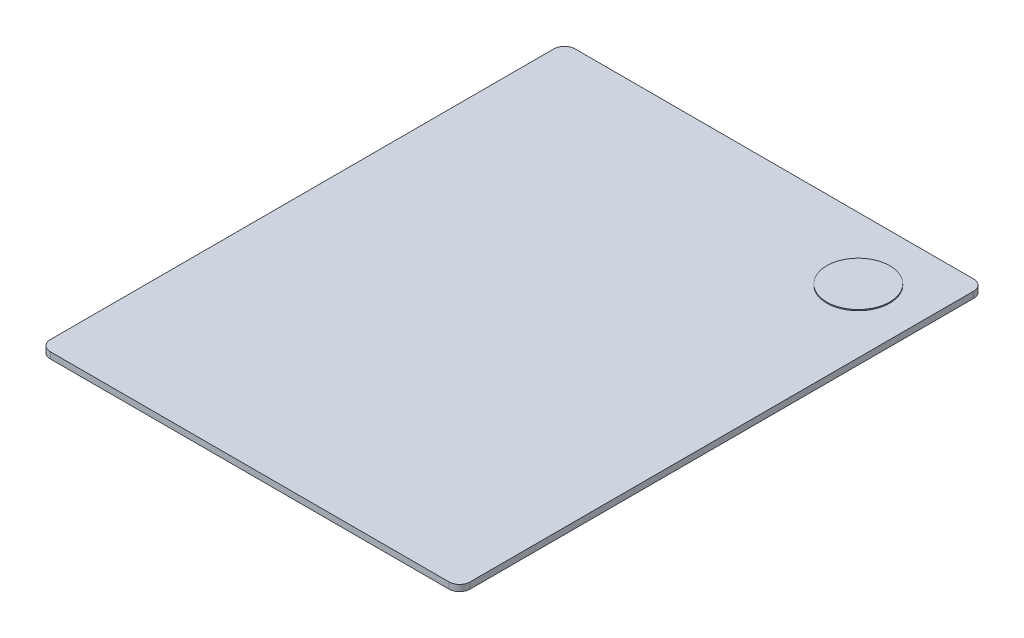
ISO-10303-21;
HEADER;
FILE_DESCRIPTION(('STEP AP214'),'2;1');
FILE_NAME('part.step','',(''),(''),'','','');
FILE_SCHEMA(('AUTOMOTIVE_DESIGN { 1 0 10303 214 1 1 1 1 }'));
ENDSEC;
DATA;
#1=APPLICATION_CONTEXT('core data for automotive mechanical design processes');
#2=APPLICATION_PROTOCOL_DEFINITION('international standard','automotive_design',2000,#1);
#3=PRODUCT_CONTEXT('',#1,'mechanical');
#4=PRODUCT('Part','Part','',(#3));
#5=PRODUCT_RELATED_PRODUCT_CATEGORY('part','',(#4));
#6=PRODUCT_DEFINITION_FORMATION('','',#4);
#7=PRODUCT_DEFINITION_CONTEXT('part definition',#1,'design');
#8=PRODUCT_DEFINITION('design','',#6,#7);
#9=PRODUCT_DEFINITION_SHAPE('','',#8);
#10=(LENGTH_UNIT() NAMED_UNIT(*) SI_UNIT(.MILLI.,.METRE.));
#11=(NAMED_UNIT(*) PLANE_ANGLE_UNIT() SI_UNIT($,.RADIAN.));
#12=(NAMED_UNIT(*) SI_UNIT($,.STERADIAN.) SOLID_ANGLE_UNIT());
#13=UNCERTAINTY_MEASURE_WITH_UNIT(LENGTH_MEASURE(1.E-05),#10,'distance_accuracy_value','');
#14=(GEOMETRIC_REPRESENTATION_CONTEXT(3) GLOBAL_UNCERTAINTY_ASSIGNED_CONTEXT((#13)) GLOBAL_UNIT_ASSIGNED_CONTEXT((#10,
#11,#12)) REPRESENTATION_CONTEXT('',''));
#15=CARTESIAN_POINT('',(0.,0.,0.));
#16=DIRECTION('',(0.,0.,1.));
#17=DIRECTION('',(1.,0.,0.));
#18=AXIS2_PLACEMENT_3D('',#15,#16,#17);
#19=CARTESIAN_POINT('',(70.,3.5,-94.9999999999999));
#20=DIRECTION('',(0.,-1.,0.));
#21=DIRECTION('',(0.,0.,-1.));
#22=AXIS2_PLACEMENT_3D('',#19,#20,#21);
#23=CYLINDRICAL_SURFACE('',#22,15.);
#24=CARTESIAN_POINT('',(70.,3.5,-94.9999999999999));
#25=DIRECTION('',(0.,1.,0.));
#26=DIRECTION('',(0.,0.,1.));
#27=AXIS2_PLACEMENT_3D('',#24,#25,#26);
#28=CIRCLE('',#27,15.);
#29=CARTESIAN_POINT('',(70.,3.5,-79.9999999999999));
#30=VERTEX_POINT('',#29);
#31=EDGE_CURVE('E11',#30,#30,#28,.T.);
#32=ORIENTED_EDGE('',*,*,#31,.F.);
#33=EDGE_LOOP('',(#32));
#34=FACE_BOUND('',#33,.T.);
#35=CARTESIAN_POINT('',(70.,3.,-94.9999999999999));
#36=DIRECTION('',(0.,1.,0.));
#37=DIRECTION('',(0.,0.,1.));
#38=AXIS2_PLACEMENT_3D('',#35,#36,#37);
#39=CIRCLE('',#38,15.);
#40=CARTESIAN_POINT('',(70.,3.,-79.9999999999999));
#41=VERTEX_POINT('',#40);
#42=EDGE_CURVE('E45',#41,#41,#39,.T.);
#43=ORIENTED_EDGE('',*,*,#42,.T.);
#44=EDGE_LOOP('',(#43));
#45=FACE_BOUND('',#44,.T.);
#46=ADVANCED_FACE('F42',(#34,#45),#23,.T.);
#47=CARTESIAN_POINT('',(0.,3.5,0.));
#48=DIRECTION('',(0.,1.,0.));
#49=DIRECTION('',(0.,0.,1.));
#50=AXIS2_PLACEMENT_3D('',#47,#48,#49);
#51=PLANE('',#50);
#52=ORIENTED_EDGE('',*,*,#31,.T.);
#53=EDGE_LOOP('',(#52));
#54=FACE_BOUND('',#53,.T.);
#55=ADVANCED_FACE('F57',(#54),#51,.T.);
#56=CARTESIAN_POINT('',(0.,3.,0.));
#57=DIRECTION('',(0.,1.,0.));
#58=DIRECTION('',(0.,0.,1.));
#59=AXIS2_PLACEMENT_3D('',#56,#57,#58);
#60=PLANE('',#59);
#61=ORIENTED_EDGE('',*,*,#42,.F.);
#62=EDGE_LOOP('',(#61));
#63=FACE_BOUND('',#62,.T.);
#64=ADVANCED_FACE('F55',(#63),#60,.F.);
#65=CLOSED_SHELL('',(#46,#55,#64));
#66=MANIFOLD_SOLID_BREP('B2',#65);
#67=CARTESIAN_POINT('',(-100.,3.,-125.));
#68=DIRECTION('',(1.,0.,0.));
#69=DIRECTION('',(0.,0.,-1.));
#70=AXIS2_PLACEMENT_3D('',#67,#68,#69);
#71=PLANE('',#70);
#72=DIRECTION('',(0.,0.,1.));
#73=VECTOR('',#72,1.);
#74=CARTESIAN_POINT('',(-100.,3.,-125.));
#75=LINE('',#74,#73);
#76=CARTESIAN_POINT('',(-100.,3.,-120.));
#77=VERTEX_POINT('',#76);
#78=CARTESIAN_POINT('',(-100.,3.,120.));
#79=VERTEX_POINT('',#78);
#80=EDGE_CURVE('E167',#77,#79,#75,.T.);
#81=ORIENTED_EDGE('',*,*,#80,.F.);
#82=DIRECTION('',(0.,-1.,0.));
#83=VECTOR('',#82,1.);
#84=CARTESIAN_POINT('',(-100.,3.,-120.));
#85=LINE('',#84,#83);
#86=CARTESIAN_POINT('',(-100.,0.,-120.));
#87=VERTEX_POINT('',#86);
#88=EDGE_CURVE('E152',#77,#87,#85,.T.);
#89=ORIENTED_EDGE('',*,*,#88,.T.);
#90=DIRECTION('',(0.,0.,1.));
#91=VECTOR('',#90,1.);
#92=CARTESIAN_POINT('',(-100.,0.,-125.));
#93=LINE('',#92,#91);
#94=CARTESIAN_POINT('',(-100.,0.,120.));
#95=VERTEX_POINT('',#94);
#96=EDGE_CURVE('E164',#87,#95,#93,.T.);
#97=ORIENTED_EDGE('',*,*,#96,.T.);
#98=DIRECTION('',(0.,-1.,0.));
#99=VECTOR('',#98,1.);
#100=CARTESIAN_POINT('',(-100.,3.,120.));
#101=LINE('',#100,#99);
#102=EDGE_CURVE('E169',#95,#79,#101,.F.);
#103=ORIENTED_EDGE('',*,*,#102,.T.);
#104=EDGE_LOOP('',(#81,#89,#97,#103));
#105=FACE_BOUND('',#104,.T.);
#106=ADVANCED_FACE('F82',(#105),#71,.F.);
#107=CARTESIAN_POINT('',(100.,3.,125.));
#108=DIRECTION('',(0.,0.,-1.));
#109=DIRECTION('',(-1.,0.,0.));
#110=AXIS2_PLACEMENT_3D('',#107,#108,#109);
#111=PLANE('',#110);
#112=DIRECTION('',(1.,0.,0.));
#113=VECTOR('',#112,1.);
#114=CARTESIAN_POINT('',(100.,3.,125.));
#115=LINE('',#114,#113);
#116=CARTESIAN_POINT('',(-95.,3.,125.));
#117=VERTEX_POINT('',#116);
#118=CARTESIAN_POINT('',(95.,3.,125.));
#119=VERTEX_POINT('',#118);
#120=EDGE_CURVE('E209',#117,#119,#115,.T.);
#121=ORIENTED_EDGE('',*,*,#120,.F.);
#122=DIRECTION('',(0.,-1.,0.));
#123=VECTOR('',#122,1.);
#124=CARTESIAN_POINT('',(-95.,3.,125.));
#125=LINE('',#124,#123);
#126=CARTESIAN_POINT('',(-95.,0.,125.));
#127=VERTEX_POINT('',#126);
#128=EDGE_CURVE('E202',#117,#127,#125,.T.);
#129=ORIENTED_EDGE('',*,*,#128,.T.);
#130=DIRECTION('',(1.,0.,0.));
#131=VECTOR('',#130,1.);
#132=CARTESIAN_POINT('',(100.,0.,125.));
#133=LINE('',#132,#131);
#134=CARTESIAN_POINT('',(95.,0.,125.));
#135=VERTEX_POINT('',#134);
#136=EDGE_CURVE('E173',#127,#135,#133,.T.);
#137=ORIENTED_EDGE('',*,*,#136,.T.);
#138=DIRECTION('',(0.,-1.,0.));
#139=VECTOR('',#138,1.);
#140=CARTESIAN_POINT('',(95.,3.,125.));
#141=LINE('',#140,#139);
#142=EDGE_CURVE('E200',#135,#119,#141,.F.);
#143=ORIENTED_EDGE('',*,*,#142,.T.);
#144=EDGE_LOOP('',(#121,#129,#137,#143));
#145=FACE_BOUND('',#144,.T.);
#146=ADVANCED_FACE('F207',(#145),#111,.F.);
#147=CARTESIAN_POINT('',(100.,3.,-125.));
#148=DIRECTION('',(-1.,0.,0.));
#149=DIRECTION('',(0.,0.,1.));
#150=AXIS2_PLACEMENT_3D('',#147,#148,#149);
#151=PLANE('',#150);
#152=DIRECTION('',(0.,0.,-1.));
#153=VECTOR('',#152,1.);
#154=CARTESIAN_POINT('',(100.,3.,-125.));
#155=LINE('',#154,#153);
#156=CARTESIAN_POINT('',(100.,3.,120.));
#157=VERTEX_POINT('',#156);
#158=CARTESIAN_POINT('',(100.,3.,-120.));
#159=VERTEX_POINT('',#158);
#160=EDGE_CURVE('E217',#157,#159,#155,.T.);
#161=ORIENTED_EDGE('',*,*,#160,.F.);
#162=DIRECTION('',(0.,-1.,0.));
#163=VECTOR('',#162,1.);
#164=CARTESIAN_POINT('',(100.,3.,120.));
#165=LINE('',#164,#163);
#166=CARTESIAN_POINT('',(100.,0.,120.));
#167=VERTEX_POINT('',#166);
#168=EDGE_CURVE('E40',#157,#167,#165,.T.);
#169=ORIENTED_EDGE('',*,*,#168,.T.);
#170=DIRECTION('',(0.,0.,-1.));
#171=VECTOR('',#170,1.);
#172=CARTESIAN_POINT('',(100.,0.,-125.));
#173=LINE('',#172,#171);
#174=CARTESIAN_POINT('',(100.,0.,-120.));
#175=VERTEX_POINT('',#174);
#176=EDGE_CURVE('E176',#167,#175,#173,.T.);
#177=ORIENTED_EDGE('',*,*,#176,.T.);
#178=DIRECTION('',(0.,-1.,0.));
#179=VECTOR('',#178,1.);
#180=CARTESIAN_POINT('',(100.,3.,-120.));
#181=LINE('',#180,#179);
#182=EDGE_CURVE('E90',#175,#159,#181,.F.);
#183=ORIENTED_EDGE('',*,*,#182,.T.);
#184=EDGE_LOOP('',(#161,#169,#177,#183));
#185=FACE_BOUND('',#184,.T.);
#186=ADVANCED_FACE('F216',(#185),#151,.F.);
#187=CARTESIAN_POINT('',(100.,3.,-125.));
#188=DIRECTION('',(0.,0.,1.));
#189=DIRECTION('',(1.,0.,0.));
#190=AXIS2_PLACEMENT_3D('',#187,#188,#189);
#191=PLANE('',#190);
#192=DIRECTION('',(-1.,0.,0.));
#193=VECTOR('',#192,1.);
#194=CARTESIAN_POINT('',(100.,0.,-125.));
#195=LINE('',#194,#193);
#196=CARTESIAN_POINT('',(95.,0.,-125.));
#197=VERTEX_POINT('',#196);
#198=CARTESIAN_POINT('',(-95.,0.,-125.));
#199=VERTEX_POINT('',#198);
#200=EDGE_CURVE('E183',#197,#199,#195,.T.);
#201=ORIENTED_EDGE('',*,*,#200,.T.);
#202=DIRECTION('',(0.,-1.,0.));
#203=VECTOR('',#202,1.);
#204=CARTESIAN_POINT('',(-95.,3.,-125.));
#205=LINE('',#204,#203);
#206=CARTESIAN_POINT('',(-95.,3.,-125.));
#207=VERTEX_POINT('',#206);
#208=EDGE_CURVE('E153',#199,#207,#205,.F.);
#209=ORIENTED_EDGE('',*,*,#208,.T.);
#210=DIRECTION('',(-1.,0.,0.));
#211=VECTOR('',#210,1.);
#212=CARTESIAN_POINT('',(100.,3.,-125.));
#213=LINE('',#212,#211);
#214=CARTESIAN_POINT('',(95.,3.,-125.));
#215=VERTEX_POINT('',#214);
#216=EDGE_CURVE('E179',#215,#207,#213,.T.);
#217=ORIENTED_EDGE('',*,*,#216,.F.);
#218=DIRECTION('',(0.,-1.,0.));
#219=VECTOR('',#218,1.);
#220=CARTESIAN_POINT('',(95.,3.,-125.));
#221=LINE('',#220,#219);
#222=EDGE_CURVE('E158',#215,#197,#221,.T.);
#223=ORIENTED_EDGE('',*,*,#222,.T.);
#224=EDGE_LOOP('',(#201,#209,#217,#223));
#225=FACE_BOUND('',#224,.T.);
#226=ADVANCED_FACE('F240',(#225),#191,.F.);
#227=CARTESIAN_POINT('',(0.,3.,0.));
#228=DIRECTION('',(0.,-1.,0.));
#229=DIRECTION('',(0.,0.,-1.));
#230=AXIS2_PLACEMENT_3D('',#227,#228,#229);
#231=PLANE('',#230);
#232=ORIENTED_EDGE('',*,*,#216,.T.);
#233=CARTESIAN_POINT('',(-95.,3.,-120.));
#234=DIRECTION('',(0.,-1.,0.));
#235=DIRECTION('',(0.,0.,-1.));
#236=AXIS2_PLACEMENT_3D('',#233,#234,#235);
#237=CIRCLE('',#236,5.);
#238=EDGE_CURVE('E198',#207,#77,#237,.F.);
#239=ORIENTED_EDGE('',*,*,#238,.T.);
#240=ORIENTED_EDGE('',*,*,#80,.T.);
#241=CARTESIAN_POINT('',(-95.,3.,120.));
#242=DIRECTION('',(0.,-1.,0.));
#243=DIRECTION('',(0.,0.,-1.));
#244=AXIS2_PLACEMENT_3D('',#241,#242,#243);
#245=CIRCLE('',#244,5.);
#246=EDGE_CURVE('E196',#79,#117,#245,.F.);
#247=ORIENTED_EDGE('',*,*,#246,.T.);
#248=ORIENTED_EDGE('',*,*,#120,.T.);
#249=CARTESIAN_POINT('',(95.,3.,120.));
#250=DIRECTION('',(0.,-1.,0.));
#251=DIRECTION('',(0.,0.,-1.));
#252=AXIS2_PLACEMENT_3D('',#249,#250,#251);
#253=CIRCLE('',#252,5.);
#254=EDGE_CURVE('E103',#119,#157,#253,.F.);
#255=ORIENTED_EDGE('',*,*,#254,.T.);
#256=ORIENTED_EDGE('',*,*,#160,.T.);
#257=CARTESIAN_POINT('',(95.,3.,-120.));
#258=DIRECTION('',(0.,-1.,0.));
#259=DIRECTION('',(0.,0.,-1.));
#260=AXIS2_PLACEMENT_3D('',#257,#258,#259);
#261=CIRCLE('',#260,5.);
#262=EDGE_CURVE('E193',#159,#215,#261,.F.);
#263=ORIENTED_EDGE('',*,*,#262,.T.);
#264=EDGE_LOOP('',(#232,#239,#240,#247,#248,#255,#256,#263));
#265=FACE_BOUND('',#264,.T.);
#266=ADVANCED_FACE('F222',(#265),#231,.F.);
#267=CARTESIAN_POINT('',(0.,0.,0.));
#268=DIRECTION('',(0.,-1.,0.));
#269=DIRECTION('',(0.,0.,-1.));
#270=AXIS2_PLACEMENT_3D('',#267,#268,#269);
#271=PLANE('',#270);
#272=ORIENTED_EDGE('',*,*,#96,.F.);
#273=CARTESIAN_POINT('',(-95.,0.,-120.));
#274=DIRECTION('',(0.,-1.,0.));
#275=DIRECTION('',(0.,0.,-1.));
#276=AXIS2_PLACEMENT_3D('',#273,#274,#275);
#277=CIRCLE('',#276,5.);
#278=EDGE_CURVE('E148',#87,#199,#277,.T.);
#279=ORIENTED_EDGE('',*,*,#278,.T.);
#280=ORIENTED_EDGE('',*,*,#200,.F.);
#281=CARTESIAN_POINT('',(95.,0.,-120.));
#282=DIRECTION('',(0.,-1.,0.));
#283=DIRECTION('',(0.,0.,-1.));
#284=AXIS2_PLACEMENT_3D('',#281,#282,#283);
#285=CIRCLE('',#284,5.);
#286=EDGE_CURVE('E168',#197,#175,#285,.T.);
#287=ORIENTED_EDGE('',*,*,#286,.T.);
#288=ORIENTED_EDGE('',*,*,#176,.F.);
#289=CARTESIAN_POINT('',(95.,0.,120.));
#290=DIRECTION('',(0.,-1.,0.));
#291=DIRECTION('',(0.,0.,-1.));
#292=AXIS2_PLACEMENT_3D('',#289,#290,#291);
#293=CIRCLE('',#292,5.);
#294=EDGE_CURVE('E187',#167,#135,#293,.T.);
#295=ORIENTED_EDGE('',*,*,#294,.T.);
#296=ORIENTED_EDGE('',*,*,#136,.F.);
#297=CARTESIAN_POINT('',(-95.,0.,120.));
#298=DIRECTION('',(0.,-1.,0.));
#299=DIRECTION('',(0.,0.,-1.));
#300=AXIS2_PLACEMENT_3D('',#297,#298,#299);
#301=CIRCLE('',#300,5.);
#302=EDGE_CURVE('E159',#127,#95,#301,.T.);
#303=ORIENTED_EDGE('',*,*,#302,.T.);
#304=EDGE_LOOP('',(#272,#279,#280,#287,#288,#295,#296,#303));
#305=FACE_BOUND('',#304,.T.);
#306=ADVANCED_FACE('F171',(#305),#271,.T.);
#307=CARTESIAN_POINT('',(-95.,3.,-120.));
#308=DIRECTION('',(0.,-1.,0.));
#309=DIRECTION('',(0.,0.,-1.));
#310=AXIS2_PLACEMENT_3D('',#307,#308,#309);
#311=CYLINDRICAL_SURFACE('',#310,5.);
#312=ORIENTED_EDGE('',*,*,#238,.F.);
#313=ORIENTED_EDGE('',*,*,#208,.F.);
#314=ORIENTED_EDGE('',*,*,#278,.F.);
#315=ORIENTED_EDGE('',*,*,#88,.F.);
#316=EDGE_LOOP('',(#312,#313,#314,#315));
#317=FACE_BOUND('',#316,.T.);
#318=ADVANCED_FACE('F151',(#317),#311,.T.);
#319=CARTESIAN_POINT('',(-95.,3.,120.));
#320=DIRECTION('',(0.,-1.,0.));
#321=DIRECTION('',(0.,0.,-1.));
#322=AXIS2_PLACEMENT_3D('',#319,#320,#321);
#323=CYLINDRICAL_SURFACE('',#322,5.);
#324=ORIENTED_EDGE('',*,*,#246,.F.);
#325=ORIENTED_EDGE('',*,*,#102,.F.);
#326=ORIENTED_EDGE('',*,*,#302,.F.);
#327=ORIENTED_EDGE('',*,*,#128,.F.);
#328=EDGE_LOOP('',(#324,#325,#326,#327));
#329=FACE_BOUND('',#328,.T.);
#330=ADVANCED_FACE('F223',(#329),#323,.T.);
#331=CARTESIAN_POINT('',(95.,3.,120.));
#332=DIRECTION('',(0.,-1.,0.));
#333=DIRECTION('',(0.,0.,-1.));
#334=AXIS2_PLACEMENT_3D('',#331,#332,#333);
#335=CYLINDRICAL_SURFACE('',#334,5.);
#336=ORIENTED_EDGE('',*,*,#254,.F.);
#337=ORIENTED_EDGE('',*,*,#142,.F.);
#338=ORIENTED_EDGE('',*,*,#294,.F.);
#339=ORIENTED_EDGE('',*,*,#168,.F.);
#340=EDGE_LOOP('',(#336,#337,#338,#339));
#341=FACE_BOUND('',#340,.T.);
#342=ADVANCED_FACE('F215',(#341),#335,.T.);
#343=CARTESIAN_POINT('',(95.,3.,-120.));
#344=DIRECTION('',(0.,-1.,0.));
#345=DIRECTION('',(0.,0.,-1.));
#346=AXIS2_PLACEMENT_3D('',#343,#344,#345);
#347=CYLINDRICAL_SURFACE('',#346,5.);
#348=ORIENTED_EDGE('',*,*,#262,.F.);
#349=ORIENTED_EDGE('',*,*,#182,.F.);
#350=ORIENTED_EDGE('',*,*,#286,.F.);
#351=ORIENTED_EDGE('',*,*,#222,.F.);
#352=EDGE_LOOP('',(#348,#349,#350,#351));
#353=FACE_BOUND('',#352,.T.);
#354=ADVANCED_FACE('F84',(#353),#347,.T.);
#355=CLOSED_SHELL('',(#106,#146,#186,#226,#266,#306,#318,#330,#342,#354));
#356=MANIFOLD_SOLID_BREP('B6',#355);
#357=ADVANCED_BREP_SHAPE_REPRESENTATION('',(#18,#66,#356),#14);
#358=SHAPE_DEFINITION_REPRESENTATION(#9,#357);
ENDSEC;
END-ISO-10303-21;
